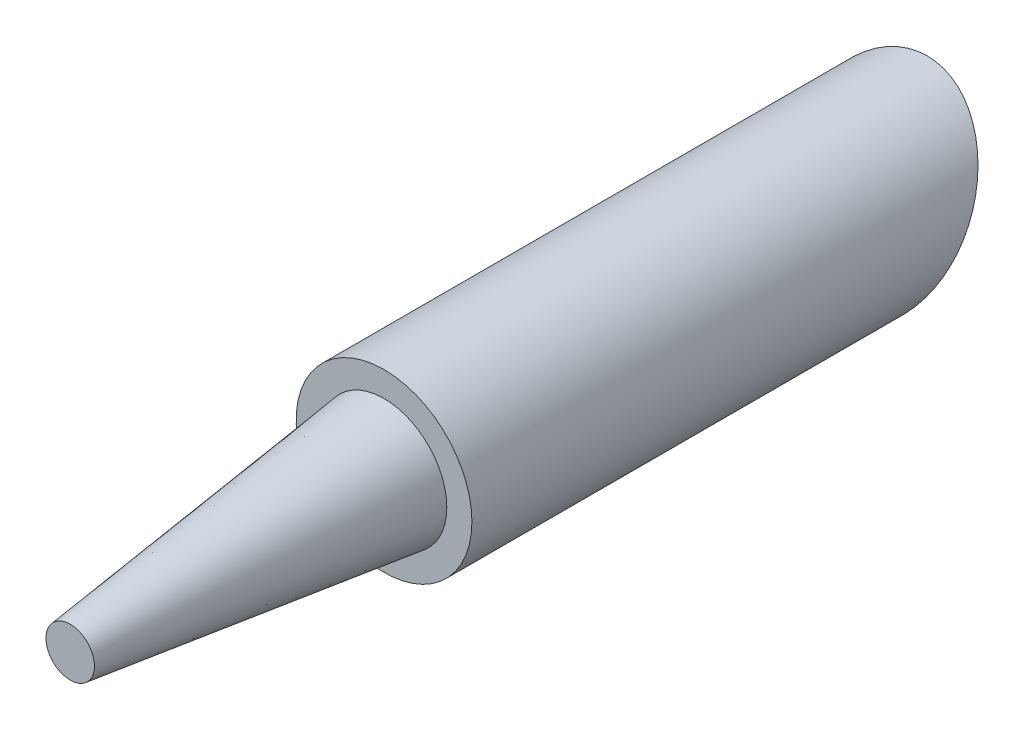
ISO-10303-21;
HEADER;
FILE_DESCRIPTION(('STEP AP214'),'2;1');
FILE_NAME('part.step','',(''),(''),'','','');
FILE_SCHEMA(('AUTOMOTIVE_DESIGN { 1 0 10303 214 1 1 1 1 }'));
ENDSEC;
DATA;
#1=APPLICATION_CONTEXT('core data for automotive mechanical design processes');
#2=APPLICATION_PROTOCOL_DEFINITION('international standard','automotive_design',2000,#1);
#3=PRODUCT_CONTEXT('',#1,'mechanical');
#4=PRODUCT('Part','Part','',(#3));
#5=PRODUCT_RELATED_PRODUCT_CATEGORY('part','',(#4));
#6=PRODUCT_DEFINITION_FORMATION('','',#4);
#7=PRODUCT_DEFINITION_CONTEXT('part definition',#1,'design');
#8=PRODUCT_DEFINITION('design','',#6,#7);
#9=PRODUCT_DEFINITION_SHAPE('','',#8);
#10=(LENGTH_UNIT() NAMED_UNIT(*) SI_UNIT(.MILLI.,.METRE.));
#11=(NAMED_UNIT(*) PLANE_ANGLE_UNIT() SI_UNIT($,.RADIAN.));
#12=(NAMED_UNIT(*) SI_UNIT($,.STERADIAN.) SOLID_ANGLE_UNIT());
#13=UNCERTAINTY_MEASURE_WITH_UNIT(LENGTH_MEASURE(1.E-05),#10,'distance_accuracy_value','');
#14=(GEOMETRIC_REPRESENTATION_CONTEXT(3) GLOBAL_UNCERTAINTY_ASSIGNED_CONTEXT((#13)) GLOBAL_UNIT_ASSIGNED_CONTEXT((#10,
#11,#12)) REPRESENTATION_CONTEXT('',''));
#15=CARTESIAN_POINT('',(0.,0.,0.));
#16=DIRECTION('',(0.,0.,1.));
#17=DIRECTION('',(1.,0.,0.));
#18=AXIS2_PLACEMENT_3D('',#15,#16,#17);
#19=CARTESIAN_POINT('',(0.,-1.11022302462516E-13,111.76));
#20=DIRECTION('',(0.,0.,-1.));
#21=DIRECTION('',(-1.,0.,0.));
#22=AXIS2_PLACEMENT_3D('',#19,#20,#21);
#23=CYLINDRICAL_SURFACE('',#22,17.78);
#24=CARTESIAN_POINT('',(0.,-1.11022302462516E-13,111.76));
#25=DIRECTION('',(0.,0.,1.));
#26=DIRECTION('',(1.,0.,0.));
#27=AXIS2_PLACEMENT_3D('',#24,#25,#26);
#28=CIRCLE('',#27,17.78);
#29=CARTESIAN_POINT('',(17.7800000000001,-1.11022302462516E-13,111.76));
#30=VERTEX_POINT('',#29);
#31=EDGE_CURVE('E40',#30,#30,#28,.T.);
#32=ORIENTED_EDGE('',*,*,#31,.F.);
#33=EDGE_LOOP('',(#32));
#34=FACE_BOUND('',#33,.T.);
#35=CARTESIAN_POINT('',(0.,0.,12.114561214139));
#36=DIRECTION('',(0.,0.499999999999997,0.866025403784441));
#37=DIRECTION('',(0.,0.866025403784442,-0.499999999999996));
#38=AXIS2_PLACEMENT_3D('',#35,#36,#37);
#39=ELLIPSE('',#38,20.530575572383,17.78);
#40=CARTESIAN_POINT('',(0.,17.78,1.84927342794754));
#41=VERTEX_POINT('',#40);
#42=EDGE_CURVE('E10',#41,#41,#39,.T.);
#43=ORIENTED_EDGE('',*,*,#42,.T.);
#44=EDGE_LOOP('',(#43));
#45=FACE_BOUND('',#44,.T.);
#46=ADVANCED_FACE('F30',(#34,#45),#23,.T.);
#47=CARTESIAN_POINT('',(0.,-1.11022302462516E-13,111.76));
#48=DIRECTION('',(0.,0.,1.));
#49=DIRECTION('',(1.,0.,0.));
#50=AXIS2_PLACEMENT_3D('',#47,#48,#49);
#51=PLANE('',#50);
#52=CARTESIAN_POINT('',(0.,-1.11022302462516E-13,111.76));
#53=DIRECTION('',(0.,0.,1.));
#54=DIRECTION('',(1.,0.,0.));
#55=AXIS2_PLACEMENT_3D('',#52,#53,#54);
#56=CIRCLE('',#55,12.7);
#57=CARTESIAN_POINT('',(12.7000000000001,-1.11022302462516E-13,111.76));
#58=VERTEX_POINT('',#57);
#59=EDGE_CURVE('E36',#58,#58,#56,.T.);
#60=ORIENTED_EDGE('',*,*,#59,.F.);
#61=EDGE_LOOP('',(#60));
#62=FACE_BOUND('',#61,.T.);
#63=ORIENTED_EDGE('',*,*,#31,.T.);
#64=EDGE_LOOP('',(#63));
#65=FACE_BOUND('',#64,.T.);
#66=ADVANCED_FACE('F54',(#62,#65),#51,.T.);
#67=CARTESIAN_POINT('',(0.,-1.11022302462516E-13,111.76));
#68=DIRECTION('',(0.,0.,-1.));
#69=DIRECTION('',(1.,0.,0.));
#70=AXIS2_PLACEMENT_3D('',#67,#68,#69);
#71=CONICAL_SURFACE('',#70,12.7,0.122173047639603);
#72=CARTESIAN_POINT('',(0.,0.,175.26));
#73=DIRECTION('',(0.,0.,1.));
#74=DIRECTION('',(1.,0.,0.));
#75=AXIS2_PLACEMENT_3D('',#72,#73,#74);
#76=CIRCLE('',#75,4.90318038266555);
#77=CARTESIAN_POINT('',(4.90318038266556,0.,175.26));
#78=VERTEX_POINT('',#77);
#79=EDGE_CURVE('E45',#78,#78,#76,.T.);
#80=ORIENTED_EDGE('',*,*,#79,.F.);
#81=EDGE_LOOP('',(#80));
#82=FACE_BOUND('',#81,.T.);
#83=ORIENTED_EDGE('',*,*,#59,.T.);
#84=EDGE_LOOP('',(#83));
#85=FACE_BOUND('',#84,.T.);
#86=ADVANCED_FACE('F52',(#82,#85),#71,.T.);
#87=CARTESIAN_POINT('',(0.,0.,175.26));
#88=DIRECTION('',(0.,0.,1.));
#89=DIRECTION('',(1.,0.,0.));
#90=AXIS2_PLACEMENT_3D('',#87,#88,#89);
#91=PLANE('',#90);
#92=ORIENTED_EDGE('',*,*,#79,.T.);
#93=EDGE_LOOP('',(#92));
#94=FACE_BOUND('',#93,.T.);
#95=ADVANCED_FACE('F50',(#94),#91,.T.);
#96=CARTESIAN_POINT('',(-17.7799999999999,49.5791943672544,-16.5099999999998));
#97=DIRECTION('',(0.,0.499999999999997,0.866025403784441));
#98=DIRECTION('',(0.,-0.866025403784442,0.499999999999996));
#99=AXIS2_PLACEMENT_3D('',#96,#97,#98);
#100=PLANE('',#99);
#101=ORIENTED_EDGE('',*,*,#42,.F.);
#102=EDGE_LOOP('',(#101));
#103=FACE_BOUND('',#102,.T.);
#104=ADVANCED_FACE('F60',(#103),#100,.F.);
#105=CLOSED_SHELL('',(#46,#66,#86,#95,#104));
#106=MANIFOLD_SOLID_BREP('B2',#105);
#107=ADVANCED_BREP_SHAPE_REPRESENTATION('',(#18,#106),#14);
#108=SHAPE_DEFINITION_REPRESENTATION(#9,#107);
ENDSEC;
END-ISO-10303-21;
